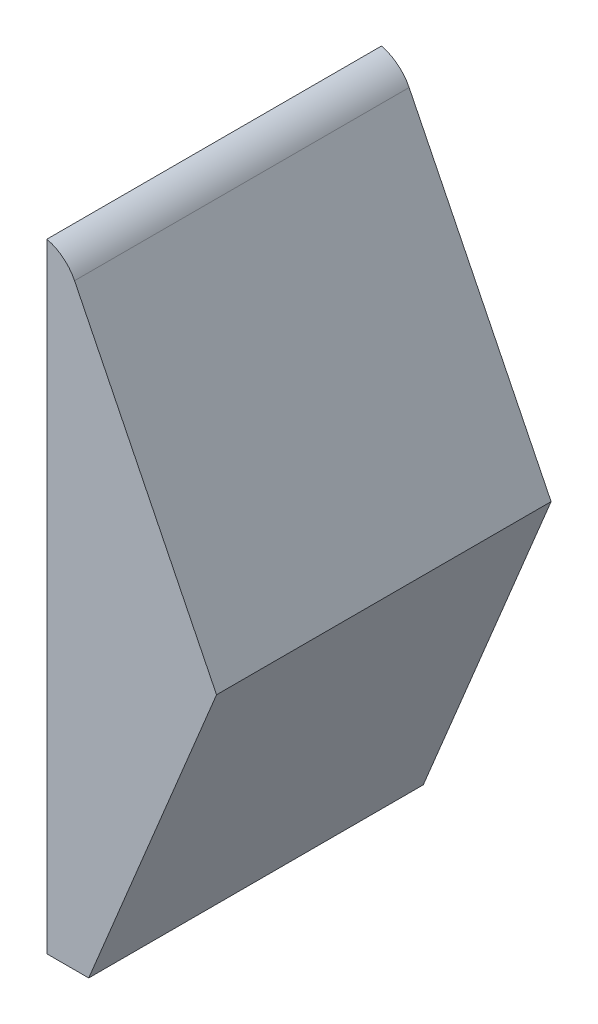
ISO-10303-21;
HEADER;
FILE_DESCRIPTION(('STEP AP214'),'2;1');
FILE_NAME('part.step','',(''),(''),'','','');
FILE_SCHEMA(('AUTOMOTIVE_DESIGN { 1 0 10303 214 1 1 1 1 }'));
ENDSEC;
DATA;
#1=APPLICATION_CONTEXT('core data for automotive mechanical design processes');
#2=APPLICATION_PROTOCOL_DEFINITION('international standard','automotive_design',2000,#1);
#3=PRODUCT_CONTEXT('',#1,'mechanical');
#4=PRODUCT('Part','Part','',(#3));
#5=PRODUCT_RELATED_PRODUCT_CATEGORY('part','',(#4));
#6=PRODUCT_DEFINITION_FORMATION('','',#4);
#7=PRODUCT_DEFINITION_CONTEXT('part definition',#1,'design');
#8=PRODUCT_DEFINITION('design','',#6,#7);
#9=PRODUCT_DEFINITION_SHAPE('','',#8);
#10=(LENGTH_UNIT() NAMED_UNIT(*) SI_UNIT(.MILLI.,.METRE.));
#11=(NAMED_UNIT(*) PLANE_ANGLE_UNIT() SI_UNIT($,.RADIAN.));
#12=(NAMED_UNIT(*) SI_UNIT($,.STERADIAN.) SOLID_ANGLE_UNIT());
#13=UNCERTAINTY_MEASURE_WITH_UNIT(LENGTH_MEASURE(1.E-05),#10,'distance_accuracy_value','');
#14=(GEOMETRIC_REPRESENTATION_CONTEXT(3) GLOBAL_UNCERTAINTY_ASSIGNED_CONTEXT((#13)) GLOBAL_UNIT_ASSIGNED_CONTEXT((#10,
#11,#12)) REPRESENTATION_CONTEXT('',''));
#15=CARTESIAN_POINT('',(0.,0.,0.));
#16=DIRECTION('',(0.,0.,1.));
#17=DIRECTION('',(1.,0.,0.));
#18=AXIS2_PLACEMENT_3D('',#15,#16,#17);
#19=CARTESIAN_POINT('',(0.,0.,-20.));
#20=DIRECTION('',(0.,-1.,0.));
#21=DIRECTION('',(1.,0.,0.));
#22=AXIS2_PLACEMENT_3D('',#19,#20,#21);
#23=PLANE('',#22);
#24=DIRECTION('',(1.,0.,0.));
#25=VECTOR('',#24,1.);
#26=CARTESIAN_POINT('',(0.,0.,20.));
#27=LINE('',#26,#25);
#28=CARTESIAN_POINT('',(0.,0.,20.));
#29=VERTEX_POINT('',#28);
#30=CARTESIAN_POINT('',(5.,0.,20.));
#31=VERTEX_POINT('',#30);
#32=EDGE_CURVE('E126',#29,#31,#27,.T.);
#33=ORIENTED_EDGE('',*,*,#32,.F.);
#34=DIRECTION('',(0.,0.,1.));
#35=VECTOR('',#34,1.);
#36=CARTESIAN_POINT('',(0.,0.,-20.));
#37=LINE('',#36,#35);
#38=CARTESIAN_POINT('',(0.,0.,-20.));
#39=VERTEX_POINT('',#38);
#40=EDGE_CURVE('E112',#39,#29,#37,.T.);
#41=ORIENTED_EDGE('',*,*,#40,.F.);
#42=DIRECTION('',(1.,0.,0.));
#43=VECTOR('',#42,1.);
#44=CARTESIAN_POINT('',(0.,0.,-20.));
#45=LINE('',#44,#43);
#46=CARTESIAN_POINT('',(5.,0.,-20.));
#47=VERTEX_POINT('',#46);
#48=EDGE_CURVE('E107',#39,#47,#45,.T.);
#49=ORIENTED_EDGE('',*,*,#48,.T.);
#50=DIRECTION('',(0.,0.,1.));
#51=VECTOR('',#50,1.);
#52=CARTESIAN_POINT('',(5.,0.,-20.));
#53=LINE('',#52,#51);
#54=EDGE_CURVE('E91',#47,#31,#53,.T.);
#55=ORIENTED_EDGE('',*,*,#54,.T.);
#56=EDGE_LOOP('',(#33,#41,#49,#55));
#57=FACE_BOUND('',#56,.T.);
#58=ADVANCED_FACE('F43',(#57),#23,.T.);
#59=CARTESIAN_POINT('',(0.,0.,-20.));
#60=DIRECTION('',(-1.,0.,0.));
#61=DIRECTION('',(0.,0.,1.));
#62=AXIS2_PLACEMENT_3D('',#59,#60,#61);
#63=PLANE('',#62);
#64=DIRECTION('',(0.,-1.,0.));
#65=VECTOR('',#64,1.);
#66=CARTESIAN_POINT('',(0.,0.,20.));
#67=LINE('',#66,#65);
#68=CARTESIAN_POINT('',(0.,74.,20.));
#69=VERTEX_POINT('',#68);
#70=EDGE_CURVE('E114',#69,#29,#67,.T.);
#71=ORIENTED_EDGE('',*,*,#70,.F.);
#72=DIRECTION('',(0.,0.,1.));
#73=VECTOR('',#72,1.);
#74=CARTESIAN_POINT('',(0.,74.,-20.));
#75=LINE('',#74,#73);
#76=CARTESIAN_POINT('',(0.,74.,-20.));
#77=VERTEX_POINT('',#76);
#78=EDGE_CURVE('E136',#77,#69,#75,.T.);
#79=ORIENTED_EDGE('',*,*,#78,.F.);
#80=DIRECTION('',(0.,-1.,0.));
#81=VECTOR('',#80,1.);
#82=CARTESIAN_POINT('',(0.,0.,-20.));
#83=LINE('',#82,#81);
#84=EDGE_CURVE('E103',#77,#39,#83,.T.);
#85=ORIENTED_EDGE('',*,*,#84,.T.);
#86=ORIENTED_EDGE('',*,*,#40,.T.);
#87=EDGE_LOOP('',(#71,#79,#85,#86));
#88=FACE_BOUND('',#87,.T.);
#89=ADVANCED_FACE('F148',(#88),#63,.T.);
#90=CARTESIAN_POINT('',(2.,74.,-20.));
#91=DIRECTION('',(0.896699055289169,0.442640716883921,0.));
#92=DIRECTION('',(-0.442640716883921,0.896699055289169,0.));
#93=AXIS2_PLACEMENT_3D('',#90,#91,#92);
#94=PLANE('',#93);
#95=DIRECTION('',(-0.442640716883921,0.896699055289169,0.));
#96=VECTOR('',#95,1.);
#97=CARTESIAN_POINT('',(2.,74.,-20.));
#98=LINE('',#97,#96);
#99=CARTESIAN_POINT('',(20.281232104032,36.9659836252561,-20.));
#100=VERTEX_POINT('',#99);
#101=CARTESIAN_POINT('',(3.30627020164317,71.3537652297066,-20.));
#102=VERTEX_POINT('',#101);
#103=EDGE_CURVE('E109',#100,#102,#98,.T.);
#104=ORIENTED_EDGE('',*,*,#103,.T.);
#105=DIRECTION('',(0.,0.,-1.));
#106=VECTOR('',#105,1.);
#107=CARTESIAN_POINT('',(3.30627020164317,71.3537652297066,20.));
#108=LINE('',#107,#106);
#109=CARTESIAN_POINT('',(3.30627020164317,71.3537652297066,20.));
#110=VERTEX_POINT('',#109);
#111=EDGE_CURVE('E135',#102,#110,#108,.F.);
#112=ORIENTED_EDGE('',*,*,#111,.T.);
#113=DIRECTION('',(-0.442640716883921,0.896699055289169,0.));
#114=VECTOR('',#113,1.);
#115=CARTESIAN_POINT('',(2.,74.,20.));
#116=LINE('',#115,#114);
#117=CARTESIAN_POINT('',(20.281232104032,36.9659836252561,20.));
#118=VERTEX_POINT('',#117);
#119=EDGE_CURVE('E119',#118,#110,#116,.T.);
#120=ORIENTED_EDGE('',*,*,#119,.F.);
#121=DIRECTION('',(0.,0.,1.));
#122=VECTOR('',#121,1.);
#123=CARTESIAN_POINT('',(20.281232104032,36.9659836252561,-20.));
#124=LINE('',#123,#122);
#125=EDGE_CURVE('E102',#100,#118,#124,.T.);
#126=ORIENTED_EDGE('',*,*,#125,.F.);
#127=EDGE_LOOP('',(#104,#112,#120,#126));
#128=FACE_BOUND('',#127,.T.);
#129=ADVANCED_FACE('F150',(#128),#94,.T.);
#130=CARTESIAN_POINT('',(5.,0.,-20.));
#131=DIRECTION('',(0.924149590631403,-0.382030802600799,0.));
#132=DIRECTION('',(0.382030802600799,0.924149590631403,0.));
#133=AXIS2_PLACEMENT_3D('',#130,#131,#132);
#134=PLANE('',#133);
#135=DIRECTION('',(0.382030802600799,0.924149590631403,0.));
#136=VECTOR('',#135,1.);
#137=CARTESIAN_POINT('',(5.,0.,20.));
#138=LINE('',#137,#136);
#139=EDGE_CURVE('E96',#31,#118,#138,.T.);
#140=ORIENTED_EDGE('',*,*,#139,.F.);
#141=ORIENTED_EDGE('',*,*,#54,.F.);
#142=DIRECTION('',(0.382030802600799,0.924149590631403,0.));
#143=VECTOR('',#142,1.);
#144=CARTESIAN_POINT('',(5.,0.,-20.));
#145=LINE('',#144,#143);
#146=EDGE_CURVE('E94',#47,#100,#145,.T.);
#147=ORIENTED_EDGE('',*,*,#146,.T.);
#148=ORIENTED_EDGE('',*,*,#125,.T.);
#149=EDGE_LOOP('',(#140,#141,#147,#148));
#150=FACE_BOUND('',#149,.T.);
#151=ADVANCED_FACE('F93',(#150),#134,.T.);
#152=CARTESIAN_POINT('',(0.,0.,-20.));
#153=DIRECTION('',(0.,0.,1.));
#154=DIRECTION('',(1.,0.,0.));
#155=AXIS2_PLACEMENT_3D('',#152,#153,#154);
#156=PLANE('',#155);
#157=ORIENTED_EDGE('',*,*,#84,.F.);
#158=CARTESIAN_POINT('',(-1.17722507480267,69.140561645287,-20.));
#159=DIRECTION('',(0.,0.,1.));
#160=DIRECTION('',(1.,0.,0.));
#161=AXIS2_PLACEMENT_3D('',#158,#159,#160);
#162=CIRCLE('',#161,5.);
#163=EDGE_CURVE('E11',#77,#102,#162,.F.);
#164=ORIENTED_EDGE('',*,*,#163,.T.);
#165=ORIENTED_EDGE('',*,*,#103,.F.);
#166=ORIENTED_EDGE('',*,*,#146,.F.);
#167=ORIENTED_EDGE('',*,*,#48,.F.);
#168=EDGE_LOOP('',(#157,#164,#165,#166,#167));
#169=FACE_BOUND('',#168,.T.);
#170=ADVANCED_FACE('F106',(#169),#156,.F.);
#171=CARTESIAN_POINT('',(0.,0.,20.));
#172=DIRECTION('',(0.,0.,1.));
#173=DIRECTION('',(1.,0.,0.));
#174=AXIS2_PLACEMENT_3D('',#171,#172,#173);
#175=PLANE('',#174);
#176=ORIENTED_EDGE('',*,*,#119,.T.);
#177=CARTESIAN_POINT('',(-1.17722507480267,69.140561645287,20.));
#178=DIRECTION('',(0.,0.,1.));
#179=DIRECTION('',(1.,0.,0.));
#180=AXIS2_PLACEMENT_3D('',#177,#178,#179);
#181=CIRCLE('',#180,5.);
#182=EDGE_CURVE('E52',#110,#69,#181,.T.);
#183=ORIENTED_EDGE('',*,*,#182,.T.);
#184=ORIENTED_EDGE('',*,*,#70,.T.);
#185=ORIENTED_EDGE('',*,*,#32,.T.);
#186=ORIENTED_EDGE('',*,*,#139,.T.);
#187=EDGE_LOOP('',(#176,#183,#184,#185,#186));
#188=FACE_BOUND('',#187,.T.);
#189=ADVANCED_FACE('F145',(#188),#175,.T.);
#190=CARTESIAN_POINT('',(-1.17722507480267,69.140561645287,-20.));
#191=DIRECTION('',(0.,0.,1.));
#192=DIRECTION('',(1.,0.,0.));
#193=AXIS2_PLACEMENT_3D('',#190,#191,#192);
#194=CYLINDRICAL_SURFACE('',#193,5.);
#195=ORIENTED_EDGE('',*,*,#163,.F.);
#196=ORIENTED_EDGE('',*,*,#78,.T.);
#197=ORIENTED_EDGE('',*,*,#182,.F.);
#198=ORIENTED_EDGE('',*,*,#111,.F.);
#199=EDGE_LOOP('',(#195,#196,#197,#198));
#200=FACE_BOUND('',#199,.T.);
#201=ADVANCED_FACE('F45',(#200),#194,.T.);
#202=CLOSED_SHELL('',(#58,#89,#129,#151,#170,#189,#201));
#203=MANIFOLD_SOLID_BREP('B2',#202);
#204=ADVANCED_BREP_SHAPE_REPRESENTATION('',(#18,#203),#14);
#205=SHAPE_DEFINITION_REPRESENTATION(#9,#204);
ENDSEC;
END-ISO-10303-21;
